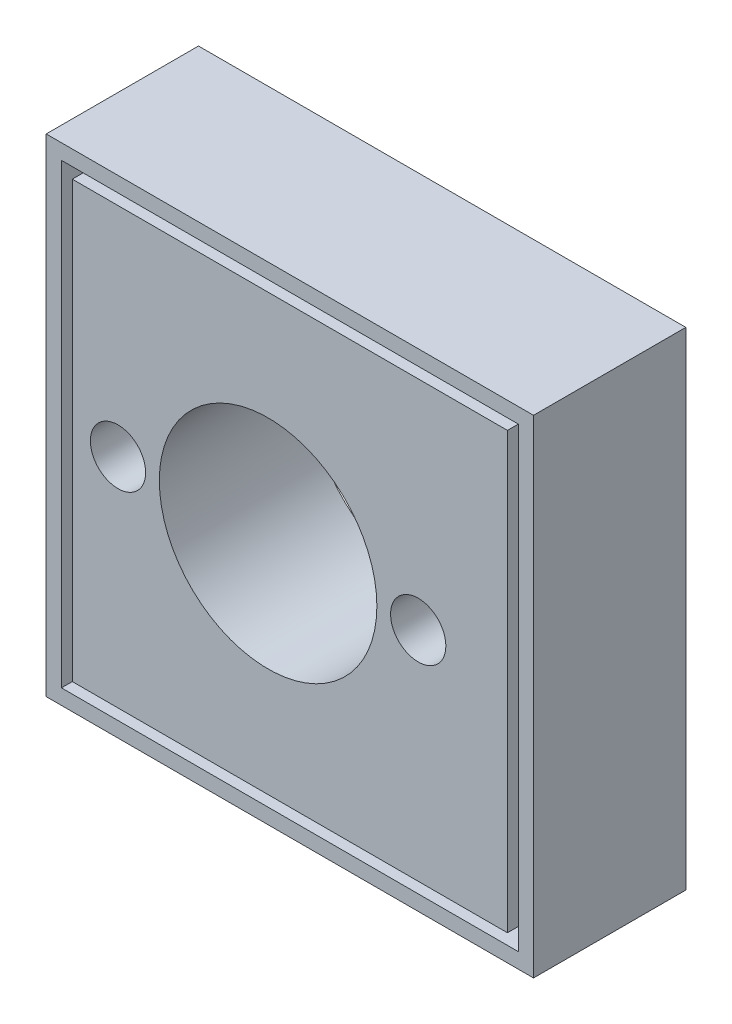
ISO-10303-21;
HEADER;
FILE_DESCRIPTION(('STEP AP214'),'2;1');
FILE_NAME('part.step','',(''),(''),'','','');
FILE_SCHEMA(('AUTOMOTIVE_DESIGN { 1 0 10303 214 1 1 1 1 }'));
ENDSEC;
DATA;
#1=APPLICATION_CONTEXT('core data for automotive mechanical design processes');
#2=APPLICATION_PROTOCOL_DEFINITION('international standard','automotive_design',2000,#1);
#3=PRODUCT_CONTEXT('',#1,'mechanical');
#4=PRODUCT('Part','Part','',(#3));
#5=PRODUCT_RELATED_PRODUCT_CATEGORY('part','',(#4));
#6=PRODUCT_DEFINITION_FORMATION('','',#4);
#7=PRODUCT_DEFINITION_CONTEXT('part definition',#1,'design');
#8=PRODUCT_DEFINITION('design','',#6,#7);
#9=PRODUCT_DEFINITION_SHAPE('','',#8);
#10=(LENGTH_UNIT() NAMED_UNIT(*) SI_UNIT(.MILLI.,.METRE.));
#11=(NAMED_UNIT(*) PLANE_ANGLE_UNIT() SI_UNIT($,.RADIAN.));
#12=(NAMED_UNIT(*) SI_UNIT($,.STERADIAN.) SOLID_ANGLE_UNIT());
#13=UNCERTAINTY_MEASURE_WITH_UNIT(LENGTH_MEASURE(1.E-05),#10,'distance_accuracy_value','');
#14=(GEOMETRIC_REPRESENTATION_CONTEXT(3) GLOBAL_UNCERTAINTY_ASSIGNED_CONTEXT((#13)) GLOBAL_UNIT_ASSIGNED_CONTEXT((#10,
#11,#12)) REPRESENTATION_CONTEXT('',''));
#15=CARTESIAN_POINT('',(0.,0.,0.));
#16=DIRECTION('',(0.,0.,1.));
#17=DIRECTION('',(1.,0.,0.));
#18=AXIS2_PLACEMENT_3D('',#15,#16,#17);
#19=CARTESIAN_POINT('',(0.,0.,15.));
#20=DIRECTION('',(0.,0.,-1.));
#21=DIRECTION('',(-1.,0.,0.));
#22=AXIS2_PLACEMENT_3D('',#19,#20,#21);
#23=PLANE('',#22);
#24=DIRECTION('',(1.,0.,0.));
#25=VECTOR('',#24,1.);
#26=CARTESIAN_POINT('',(0.,-52.5,15.));
#27=LINE('',#26,#25);
#28=CARTESIAN_POINT('',(-52.5,-52.5,15.));
#29=VERTEX_POINT('',#28);
#30=CARTESIAN_POINT('',(52.5,-52.5,15.));
#31=VERTEX_POINT('',#30);
#32=EDGE_CURVE('E81',#29,#31,#27,.T.);
#33=ORIENTED_EDGE('',*,*,#32,.T.);
#34=DIRECTION('',(0.,1.,0.));
#35=VECTOR('',#34,1.);
#36=CARTESIAN_POINT('',(52.5,0.,15.));
#37=LINE('',#36,#35);
#38=CARTESIAN_POINT('',(52.5,52.5,15.));
#39=VERTEX_POINT('',#38);
#40=EDGE_CURVE('E159',#31,#39,#37,.T.);
#41=ORIENTED_EDGE('',*,*,#40,.T.);
#42=DIRECTION('',(1.,0.,0.));
#43=VECTOR('',#42,1.);
#44=CARTESIAN_POINT('',(0.,52.5,15.));
#45=LINE('',#44,#43);
#46=CARTESIAN_POINT('',(-52.5,52.5,15.));
#47=VERTEX_POINT('',#46);
#48=EDGE_CURVE('E175',#47,#39,#45,.T.);
#49=ORIENTED_EDGE('',*,*,#48,.F.);
#50=DIRECTION('',(0.,1.,0.));
#51=VECTOR('',#50,1.);
#52=CARTESIAN_POINT('',(-52.5,0.,15.));
#53=LINE('',#52,#51);
#54=EDGE_CURVE('E86',#29,#47,#53,.T.);
#55=ORIENTED_EDGE('',*,*,#54,.F.);
#56=EDGE_LOOP('',(#33,#41,#49,#55));
#57=FACE_BOUND('',#56,.T.);
#58=DIRECTION('',(1.,0.,0.));
#59=VECTOR('',#58,1.);
#60=CARTESIAN_POINT('',(0.,50.,15.));
#61=LINE('',#60,#59);
#62=CARTESIAN_POINT('',(-50.,50.,15.));
#63=VERTEX_POINT('',#62);
#64=CARTESIAN_POINT('',(50.,50.,15.));
#65=VERTEX_POINT('',#64);
#66=EDGE_CURVE('E261',#63,#65,#61,.T.);
#67=ORIENTED_EDGE('',*,*,#66,.T.);
#68=DIRECTION('',(0.,-1.,0.));
#69=VECTOR('',#68,1.);
#70=CARTESIAN_POINT('',(50.,0.,15.));
#71=LINE('',#70,#69);
#72=CARTESIAN_POINT('',(50.,-50.,15.));
#73=VERTEX_POINT('',#72);
#74=EDGE_CURVE('E257',#65,#73,#71,.T.);
#75=ORIENTED_EDGE('',*,*,#74,.T.);
#76=DIRECTION('',(1.,0.,0.));
#77=VECTOR('',#76,1.);
#78=CARTESIAN_POINT('',(0.,-50.,15.));
#79=LINE('',#78,#77);
#80=CARTESIAN_POINT('',(-50.,-50.,15.));
#81=VERTEX_POINT('',#80);
#82=EDGE_CURVE('E226',#81,#73,#79,.T.);
#83=ORIENTED_EDGE('',*,*,#82,.F.);
#84=DIRECTION('',(0.,-1.,0.));
#85=VECTOR('',#84,1.);
#86=CARTESIAN_POINT('',(-50.,0.,15.));
#87=LINE('',#86,#85);
#88=EDGE_CURVE('E265',#63,#81,#87,.T.);
#89=ORIENTED_EDGE('',*,*,#88,.F.);
#90=EDGE_LOOP('',(#67,#75,#83,#89));
#91=FACE_BOUND('',#90,.T.);
#92=ADVANCED_FACE('F65',(#57,#91),#23,.F.);
#93=CARTESIAN_POINT('',(0.,0.,0.));
#94=DIRECTION('',(0.,0.,-1.));
#95=DIRECTION('',(-1.,0.,0.));
#96=AXIS2_PLACEMENT_3D('',#93,#94,#95);
#97=PLANE('',#96);
#98=DIRECTION('',(0.,1.,0.));
#99=VECTOR('',#98,1.);
#100=CARTESIAN_POINT('',(56.,-56.,0.));
#101=LINE('',#100,#99);
#102=CARTESIAN_POINT('',(56.,-56.,0.));
#103=VERTEX_POINT('',#102);
#104=CARTESIAN_POINT('',(56.,56.,0.));
#105=VERTEX_POINT('',#104);
#106=EDGE_CURVE('E288',#103,#105,#101,.T.);
#107=ORIENTED_EDGE('',*,*,#106,.F.);
#108=DIRECTION('',(1.,0.,0.));
#109=VECTOR('',#108,1.);
#110=CARTESIAN_POINT('',(-56.,-56.,0.));
#111=LINE('',#110,#109);
#112=CARTESIAN_POINT('',(-56.,-56.,0.));
#113=VERTEX_POINT('',#112);
#114=EDGE_CURVE('E298',#113,#103,#111,.T.);
#115=ORIENTED_EDGE('',*,*,#114,.F.);
#116=DIRECTION('',(0.,-1.,0.));
#117=VECTOR('',#116,1.);
#118=CARTESIAN_POINT('',(-56.,-56.,0.));
#119=LINE('',#118,#117);
#120=CARTESIAN_POINT('',(-56.,56.,0.));
#121=VERTEX_POINT('',#120);
#122=EDGE_CURVE('E295',#121,#113,#119,.T.);
#123=ORIENTED_EDGE('',*,*,#122,.F.);
#124=DIRECTION('',(-1.,0.,0.));
#125=VECTOR('',#124,1.);
#126=CARTESIAN_POINT('',(-56.,56.,0.));
#127=LINE('',#126,#125);
#128=EDGE_CURVE('E292',#105,#121,#127,.T.);
#129=ORIENTED_EDGE('',*,*,#128,.F.);
#130=EDGE_LOOP('',(#107,#115,#123,#129));
#131=FACE_BOUND('',#130,.T.);
#132=CARTESIAN_POINT('',(-5.,0.,0.));
#133=DIRECTION('',(0.,0.,1.));
#134=DIRECTION('',(1.,0.,0.));
#135=AXIS2_PLACEMENT_3D('',#132,#133,#134);
#136=CIRCLE('',#135,25.);
#137=CARTESIAN_POINT('',(20.,0.,0.));
#138=VERTEX_POINT('',#137);
#139=EDGE_CURVE('E284',#138,#138,#136,.T.);
#140=ORIENTED_EDGE('',*,*,#139,.T.);
#141=EDGE_LOOP('',(#140));
#142=FACE_BOUND('',#141,.T.);
#143=ADVANCED_FACE('F319',(#131,#142),#97,.T.);
#144=CARTESIAN_POINT('',(56.,-56.,15.));
#145=DIRECTION('',(-1.,0.,0.));
#146=DIRECTION('',(0.,0.,1.));
#147=AXIS2_PLACEMENT_3D('',#144,#145,#146);
#148=PLANE('',#147);
#149=ORIENTED_EDGE('',*,*,#106,.T.);
#150=DIRECTION('',(0.,0.,-1.));
#151=VECTOR('',#150,1.);
#152=CARTESIAN_POINT('',(56.,56.,15.));
#153=LINE('',#152,#151);
#154=CARTESIAN_POINT('',(56.,56.,35.));
#155=VERTEX_POINT('',#154);
#156=EDGE_CURVE('E12',#155,#105,#153,.T.);
#157=ORIENTED_EDGE('',*,*,#156,.F.);
#158=DIRECTION('',(0.,1.,0.));
#159=VECTOR('',#158,1.);
#160=CARTESIAN_POINT('',(56.,0.,35.));
#161=LINE('',#160,#159);
#162=CARTESIAN_POINT('',(56.,-56.,35.));
#163=VERTEX_POINT('',#162);
#164=EDGE_CURVE('E191',#163,#155,#161,.T.);
#165=ORIENTED_EDGE('',*,*,#164,.F.);
#166=DIRECTION('',(0.,0.,-1.));
#167=VECTOR('',#166,1.);
#168=CARTESIAN_POINT('',(56.,-56.,15.));
#169=LINE('',#168,#167);
#170=EDGE_CURVE('E301',#163,#103,#169,.T.);
#171=ORIENTED_EDGE('',*,*,#170,.T.);
#172=EDGE_LOOP('',(#149,#157,#165,#171));
#173=FACE_BOUND('',#172,.T.);
#174=ADVANCED_FACE('F67',(#173),#148,.F.);
#175=CARTESIAN_POINT('',(-56.,56.,15.));
#176=DIRECTION('',(0.,-1.,0.));
#177=DIRECTION('',(0.,0.,-1.));
#178=AXIS2_PLACEMENT_3D('',#175,#176,#177);
#179=PLANE('',#178);
#180=ORIENTED_EDGE('',*,*,#128,.T.);
#181=DIRECTION('',(0.,0.,-1.));
#182=VECTOR('',#181,1.);
#183=CARTESIAN_POINT('',(-56.,56.,15.));
#184=LINE('',#183,#182);
#185=CARTESIAN_POINT('',(-56.,56.,35.));
#186=VERTEX_POINT('',#185);
#187=EDGE_CURVE('E74',#186,#121,#184,.T.);
#188=ORIENTED_EDGE('',*,*,#187,.F.);
#189=DIRECTION('',(-1.,0.,0.));
#190=VECTOR('',#189,1.);
#191=CARTESIAN_POINT('',(0.,56.,35.));
#192=LINE('',#191,#190);
#193=EDGE_CURVE('E195',#155,#186,#192,.T.);
#194=ORIENTED_EDGE('',*,*,#193,.F.);
#195=ORIENTED_EDGE('',*,*,#156,.T.);
#196=EDGE_LOOP('',(#180,#188,#194,#195));
#197=FACE_BOUND('',#196,.T.);
#198=ADVANCED_FACE('F326',(#197),#179,.F.);
#199=CARTESIAN_POINT('',(-56.,-56.,15.));
#200=DIRECTION('',(1.,0.,0.));
#201=DIRECTION('',(0.,0.,-1.));
#202=AXIS2_PLACEMENT_3D('',#199,#200,#201);
#203=PLANE('',#202);
#204=ORIENTED_EDGE('',*,*,#122,.T.);
#205=DIRECTION('',(0.,0.,-1.));
#206=VECTOR('',#205,1.);
#207=CARTESIAN_POINT('',(-56.,-56.,15.));
#208=LINE('',#207,#206);
#209=CARTESIAN_POINT('',(-56.,-56.,35.));
#210=VERTEX_POINT('',#209);
#211=EDGE_CURVE('E305',#210,#113,#208,.T.);
#212=ORIENTED_EDGE('',*,*,#211,.F.);
#213=DIRECTION('',(0.,-1.,0.));
#214=VECTOR('',#213,1.);
#215=CARTESIAN_POINT('',(-56.,0.,35.));
#216=LINE('',#215,#214);
#217=EDGE_CURVE('E199',#186,#210,#216,.T.);
#218=ORIENTED_EDGE('',*,*,#217,.F.);
#219=ORIENTED_EDGE('',*,*,#187,.T.);
#220=EDGE_LOOP('',(#204,#212,#218,#219));
#221=FACE_BOUND('',#220,.T.);
#222=ADVANCED_FACE('F313',(#221),#203,.F.);
#223=CARTESIAN_POINT('',(-56.,-56.,15.));
#224=DIRECTION('',(0.,1.,0.));
#225=DIRECTION('',(0.,0.,1.));
#226=AXIS2_PLACEMENT_3D('',#223,#224,#225);
#227=PLANE('',#226);
#228=ORIENTED_EDGE('',*,*,#114,.T.);
#229=ORIENTED_EDGE('',*,*,#170,.F.);
#230=DIRECTION('',(1.,0.,0.));
#231=VECTOR('',#230,1.);
#232=CARTESIAN_POINT('',(0.,-56.,35.));
#233=LINE('',#232,#231);
#234=EDGE_CURVE('E187',#210,#163,#233,.T.);
#235=ORIENTED_EDGE('',*,*,#234,.F.);
#236=ORIENTED_EDGE('',*,*,#211,.T.);
#237=EDGE_LOOP('',(#228,#229,#235,#236));
#238=FACE_BOUND('',#237,.T.);
#239=ADVANCED_FACE('F322',(#238),#227,.F.);
#240=CARTESIAN_POINT('',(-5.,0.,15.));
#241=DIRECTION('',(0.,0.,-1.));
#242=DIRECTION('',(-1.,0.,0.));
#243=AXIS2_PLACEMENT_3D('',#240,#241,#242);
#244=CYLINDRICAL_SURFACE('',#243,25.);
#245=ORIENTED_EDGE('',*,*,#139,.F.);
#246=EDGE_LOOP('',(#245));
#247=FACE_BOUND('',#246,.T.);
#248=CARTESIAN_POINT('',(-5.,0.,35.));
#249=DIRECTION('',(0.,0.,1.));
#250=DIRECTION('',(1.,0.,0.));
#251=AXIS2_PLACEMENT_3D('',#248,#249,#250);
#252=CIRCLE('',#251,25.);
#253=CARTESIAN_POINT('',(20.,0.,35.));
#254=VERTEX_POINT('',#253);
#255=EDGE_CURVE('E245',#254,#254,#252,.F.);
#256=ORIENTED_EDGE('',*,*,#255,.F.);
#257=EDGE_LOOP('',(#256));
#258=FACE_BOUND('',#257,.T.);
#259=ADVANCED_FACE('F373',(#247,#258),#244,.F.);
#260=CARTESIAN_POINT('',(50.,0.,35.));
#261=DIRECTION('',(1.,0.,0.));
#262=DIRECTION('',(0.,1.,0.));
#263=AXIS2_PLACEMENT_3D('',#260,#261,#262);
#264=PLANE('',#263);
#265=ORIENTED_EDGE('',*,*,#74,.F.);
#266=DIRECTION('',(0.,0.,-1.));
#267=VECTOR('',#266,1.);
#268=CARTESIAN_POINT('',(50.,50.,35.));
#269=LINE('',#268,#267);
#270=CARTESIAN_POINT('',(50.,50.,35.));
#271=VERTEX_POINT('',#270);
#272=EDGE_CURVE('E280',#271,#65,#269,.T.);
#273=ORIENTED_EDGE('',*,*,#272,.F.);
#274=DIRECTION('',(0.,-1.,0.));
#275=VECTOR('',#274,1.);
#276=CARTESIAN_POINT('',(50.,0.,35.));
#277=LINE('',#276,#275);
#278=CARTESIAN_POINT('',(50.,-50.,35.));
#279=VERTEX_POINT('',#278);
#280=EDGE_CURVE('E230',#271,#279,#277,.T.);
#281=ORIENTED_EDGE('',*,*,#280,.T.);
#282=DIRECTION('',(0.,0.,-1.));
#283=VECTOR('',#282,1.);
#284=CARTESIAN_POINT('',(50.,-50.,35.));
#285=LINE('',#284,#283);
#286=EDGE_CURVE('E249',#279,#73,#285,.T.);
#287=ORIENTED_EDGE('',*,*,#286,.T.);
#288=EDGE_LOOP('',(#265,#273,#281,#287));
#289=FACE_BOUND('',#288,.T.);
#290=ADVANCED_FACE('F371',(#289),#264,.T.);
#291=CARTESIAN_POINT('',(0.,50.,35.));
#292=DIRECTION('',(0.,1.,0.));
#293=DIRECTION('',(0.,0.,1.));
#294=AXIS2_PLACEMENT_3D('',#291,#292,#293);
#295=PLANE('',#294);
#296=ORIENTED_EDGE('',*,*,#66,.F.);
#297=DIRECTION('',(0.,0.,-1.));
#298=VECTOR('',#297,1.);
#299=CARTESIAN_POINT('',(-50.,50.,35.));
#300=LINE('',#299,#298);
#301=CARTESIAN_POINT('',(-50.,50.,35.));
#302=VERTEX_POINT('',#301);
#303=EDGE_CURVE('E277',#302,#63,#300,.T.);
#304=ORIENTED_EDGE('',*,*,#303,.F.);
#305=DIRECTION('',(1.,0.,0.));
#306=VECTOR('',#305,1.);
#307=CARTESIAN_POINT('',(0.,50.,35.));
#308=LINE('',#307,#306);
#309=EDGE_CURVE('E234',#302,#271,#308,.T.);
#310=ORIENTED_EDGE('',*,*,#309,.T.);
#311=ORIENTED_EDGE('',*,*,#272,.T.);
#312=EDGE_LOOP('',(#296,#304,#310,#311));
#313=FACE_BOUND('',#312,.T.);
#314=ADVANCED_FACE('F380',(#313),#295,.T.);
#315=CARTESIAN_POINT('',(-50.,0.,35.));
#316=DIRECTION('',(1.,0.,0.));
#317=DIRECTION('',(0.,1.,0.));
#318=AXIS2_PLACEMENT_3D('',#315,#316,#317);
#319=PLANE('',#318);
#320=ORIENTED_EDGE('',*,*,#88,.T.);
#321=DIRECTION('',(0.,0.,-1.));
#322=VECTOR('',#321,1.);
#323=CARTESIAN_POINT('',(-50.,-50.,35.));
#324=LINE('',#323,#322);
#325=CARTESIAN_POINT('',(-50.,-50.,35.));
#326=VERTEX_POINT('',#325);
#327=EDGE_CURVE('E274',#326,#81,#324,.T.);
#328=ORIENTED_EDGE('',*,*,#327,.F.);
#329=DIRECTION('',(0.,-1.,0.));
#330=VECTOR('',#329,1.);
#331=CARTESIAN_POINT('',(-50.,0.,35.));
#332=LINE('',#331,#330);
#333=EDGE_CURVE('E238',#302,#326,#332,.T.);
#334=ORIENTED_EDGE('',*,*,#333,.F.);
#335=ORIENTED_EDGE('',*,*,#303,.T.);
#336=EDGE_LOOP('',(#320,#328,#334,#335));
#337=FACE_BOUND('',#336,.T.);
#338=ADVANCED_FACE('F367',(#337),#319,.F.);
#339=CARTESIAN_POINT('',(0.,-50.,35.));
#340=DIRECTION('',(0.,1.,0.));
#341=DIRECTION('',(0.,0.,1.));
#342=AXIS2_PLACEMENT_3D('',#339,#340,#341);
#343=PLANE('',#342);
#344=ORIENTED_EDGE('',*,*,#82,.T.);
#345=ORIENTED_EDGE('',*,*,#286,.F.);
#346=DIRECTION('',(1.,0.,0.));
#347=VECTOR('',#346,1.);
#348=CARTESIAN_POINT('',(0.,-50.,35.));
#349=LINE('',#348,#347);
#350=EDGE_CURVE('E242',#326,#279,#349,.T.);
#351=ORIENTED_EDGE('',*,*,#350,.F.);
#352=ORIENTED_EDGE('',*,*,#327,.T.);
#353=EDGE_LOOP('',(#344,#345,#351,#352));
#354=FACE_BOUND('',#353,.T.);
#355=ADVANCED_FACE('F358',(#354),#343,.F.);
#356=CARTESIAN_POINT('',(-39.5,0.,35.));
#357=DIRECTION('',(0.,0.,-1.));
#358=DIRECTION('',(-1.,0.,0.));
#359=AXIS2_PLACEMENT_3D('',#356,#357,#358);
#360=CYLINDRICAL_SURFACE('',#359,6.35);
#361=CARTESIAN_POINT('',(-39.5,0.,35.));
#362=DIRECTION('',(0.,0.,1.));
#363=DIRECTION('',(1.,0.,0.));
#364=AXIS2_PLACEMENT_3D('',#361,#362,#363);
#365=CIRCLE('',#364,6.35);
#366=CARTESIAN_POINT('',(-33.15,0.,35.));
#367=VERTEX_POINT('',#366);
#368=EDGE_CURVE('E225',#367,#367,#365,.T.);
#369=ORIENTED_EDGE('',*,*,#368,.T.);
#370=EDGE_LOOP('',(#369));
#371=FACE_BOUND('',#370,.T.);
#372=CARTESIAN_POINT('',(-39.5,0.,15.));
#373=DIRECTION('',(0.,0.,1.));
#374=DIRECTION('',(1.,0.,0.));
#375=AXIS2_PLACEMENT_3D('',#372,#373,#374);
#376=CIRCLE('',#375,6.35);
#377=CARTESIAN_POINT('',(-33.15,0.,15.));
#378=VERTEX_POINT('',#377);
#379=EDGE_CURVE('E253',#378,#378,#376,.T.);
#380=ORIENTED_EDGE('',*,*,#379,.F.);
#381=EDGE_LOOP('',(#380));
#382=FACE_BOUND('',#381,.T.);
#383=ADVANCED_FACE('F356',(#371,#382),#360,.F.);
#384=CARTESIAN_POINT('',(29.5,0.,35.));
#385=DIRECTION('',(0.,0.,-1.));
#386=DIRECTION('',(-1.,0.,0.));
#387=AXIS2_PLACEMENT_3D('',#384,#385,#386);
#388=CYLINDRICAL_SURFACE('',#387,6.35);
#389=CARTESIAN_POINT('',(29.5,0.,35.));
#390=DIRECTION('',(0.,0.,1.));
#391=DIRECTION('',(1.,0.,0.));
#392=AXIS2_PLACEMENT_3D('',#389,#390,#391);
#393=CIRCLE('',#392,6.35);
#394=CARTESIAN_POINT('',(35.85,0.,35.));
#395=VERTEX_POINT('',#394);
#396=EDGE_CURVE('E221',#395,#395,#393,.T.);
#397=ORIENTED_EDGE('',*,*,#396,.T.);
#398=EDGE_LOOP('',(#397));
#399=FACE_BOUND('',#398,.T.);
#400=CARTESIAN_POINT('',(29.5,0.,15.));
#401=DIRECTION('',(0.,0.,1.));
#402=DIRECTION('',(1.,0.,0.));
#403=AXIS2_PLACEMENT_3D('',#400,#401,#402);
#404=CIRCLE('',#403,6.35);
#405=CARTESIAN_POINT('',(35.85,0.,15.));
#406=VERTEX_POINT('',#405);
#407=EDGE_CURVE('E163',#406,#406,#404,.T.);
#408=ORIENTED_EDGE('',*,*,#407,.F.);
#409=EDGE_LOOP('',(#408));
#410=FACE_BOUND('',#409,.T.);
#411=ADVANCED_FACE('F351',(#399,#410),#388,.F.);
#412=CARTESIAN_POINT('',(0.,0.,35.));
#413=DIRECTION('',(0.,0.,1.));
#414=DIRECTION('',(1.,0.,0.));
#415=AXIS2_PLACEMENT_3D('',#412,#413,#414);
#416=PLANE('',#415);
#417=ORIENTED_EDGE('',*,*,#396,.F.);
#418=EDGE_LOOP('',(#417));
#419=FACE_BOUND('',#418,.T.);
#420=ORIENTED_EDGE('',*,*,#368,.F.);
#421=EDGE_LOOP('',(#420));
#422=FACE_BOUND('',#421,.T.);
#423=ORIENTED_EDGE('',*,*,#280,.F.);
#424=ORIENTED_EDGE('',*,*,#309,.F.);
#425=ORIENTED_EDGE('',*,*,#333,.T.);
#426=ORIENTED_EDGE('',*,*,#350,.T.);
#427=EDGE_LOOP('',(#423,#424,#425,#426));
#428=FACE_BOUND('',#427,.T.);
#429=ORIENTED_EDGE('',*,*,#255,.T.);
#430=EDGE_LOOP('',(#429));
#431=FACE_BOUND('',#430,.T.);
#432=ADVANCED_FACE('F346',(#419,#422,#428,#431),#416,.T.);
#433=ORIENTED_EDGE('',*,*,#379,.T.);
#434=EDGE_LOOP('',(#433));
#435=FACE_BOUND('',#434,.T.);
#436=ADVANCED_FACE('F336',(#435),#23,.F.);
#437=ORIENTED_EDGE('',*,*,#407,.T.);
#438=EDGE_LOOP('',(#437));
#439=FACE_BOUND('',#438,.T.);
#440=ADVANCED_FACE('F335',(#439),#23,.F.);
#441=CARTESIAN_POINT('',(52.5,0.,35.));
#442=DIRECTION('',(-1.,0.,0.));
#443=DIRECTION('',(0.,0.,1.));
#444=AXIS2_PLACEMENT_3D('',#441,#442,#443);
#445=PLANE('',#444);
#446=ORIENTED_EDGE('',*,*,#40,.F.);
#447=DIRECTION('',(0.,0.,-1.));
#448=VECTOR('',#447,1.);
#449=CARTESIAN_POINT('',(52.5,-52.5,35.));
#450=LINE('',#449,#448);
#451=CARTESIAN_POINT('',(52.5,-52.5,35.));
#452=VERTEX_POINT('',#451);
#453=EDGE_CURVE('E154',#452,#31,#450,.T.);
#454=ORIENTED_EDGE('',*,*,#453,.F.);
#455=DIRECTION('',(0.,1.,0.));
#456=VECTOR('',#455,1.);
#457=CARTESIAN_POINT('',(52.5,0.,35.));
#458=LINE('',#457,#456);
#459=CARTESIAN_POINT('',(52.5,52.5,35.));
#460=VERTEX_POINT('',#459);
#461=EDGE_CURVE('E158',#452,#460,#458,.T.);
#462=ORIENTED_EDGE('',*,*,#461,.T.);
#463=DIRECTION('',(0.,0.,-1.));
#464=VECTOR('',#463,1.);
#465=CARTESIAN_POINT('',(52.5,52.5,35.));
#466=LINE('',#465,#464);
#467=EDGE_CURVE('E203',#460,#39,#466,.T.);
#468=ORIENTED_EDGE('',*,*,#467,.T.);
#469=EDGE_LOOP('',(#446,#454,#462,#468));
#470=FACE_BOUND('',#469,.T.);
#471=ADVANCED_FACE('F156',(#470),#445,.T.);
#472=CARTESIAN_POINT('',(0.,-52.5,35.));
#473=DIRECTION('',(0.,1.,0.));
#474=DIRECTION('',(0.,0.,1.));
#475=AXIS2_PLACEMENT_3D('',#472,#473,#474);
#476=PLANE('',#475);
#477=ORIENTED_EDGE('',*,*,#32,.F.);
#478=DIRECTION('',(0.,0.,-1.));
#479=VECTOR('',#478,1.);
#480=CARTESIAN_POINT('',(-52.5,-52.5,35.));
#481=LINE('',#480,#479);
#482=CARTESIAN_POINT('',(-52.5,-52.5,35.));
#483=VERTEX_POINT('',#482);
#484=EDGE_CURVE('E164',#483,#29,#481,.T.);
#485=ORIENTED_EDGE('',*,*,#484,.F.);
#486=DIRECTION('',(1.,0.,0.));
#487=VECTOR('',#486,1.);
#488=CARTESIAN_POINT('',(0.,-52.5,35.));
#489=LINE('',#488,#487);
#490=EDGE_CURVE('E170',#483,#452,#489,.T.);
#491=ORIENTED_EDGE('',*,*,#490,.T.);
#492=ORIENTED_EDGE('',*,*,#453,.T.);
#493=EDGE_LOOP('',(#477,#485,#491,#492));
#494=FACE_BOUND('',#493,.T.);
#495=ADVANCED_FACE('F177',(#494),#476,.T.);
#496=CARTESIAN_POINT('',(-52.5,0.,35.));
#497=DIRECTION('',(-1.,0.,0.));
#498=DIRECTION('',(0.,0.,1.));
#499=AXIS2_PLACEMENT_3D('',#496,#497,#498);
#500=PLANE('',#499);
#501=ORIENTED_EDGE('',*,*,#54,.T.);
#502=DIRECTION('',(0.,0.,-1.));
#503=VECTOR('',#502,1.);
#504=CARTESIAN_POINT('',(-52.5,52.5,35.));
#505=LINE('',#504,#503);
#506=CARTESIAN_POINT('',(-52.5,52.5,35.));
#507=VERTEX_POINT('',#506);
#508=EDGE_CURVE('E215',#507,#47,#505,.T.);
#509=ORIENTED_EDGE('',*,*,#508,.F.);
#510=DIRECTION('',(0.,1.,0.));
#511=VECTOR('',#510,1.);
#512=CARTESIAN_POINT('',(-52.5,0.,35.));
#513=LINE('',#512,#511);
#514=EDGE_CURVE('E180',#483,#507,#513,.T.);
#515=ORIENTED_EDGE('',*,*,#514,.F.);
#516=ORIENTED_EDGE('',*,*,#484,.T.);
#517=EDGE_LOOP('',(#501,#509,#515,#516));
#518=FACE_BOUND('',#517,.T.);
#519=ADVANCED_FACE('F463',(#518),#500,.F.);
#520=CARTESIAN_POINT('',(0.,52.5,35.));
#521=DIRECTION('',(0.,1.,0.));
#522=DIRECTION('',(0.,0.,1.));
#523=AXIS2_PLACEMENT_3D('',#520,#521,#522);
#524=PLANE('',#523);
#525=ORIENTED_EDGE('',*,*,#48,.T.);
#526=ORIENTED_EDGE('',*,*,#467,.F.);
#527=DIRECTION('',(1.,0.,0.));
#528=VECTOR('',#527,1.);
#529=CARTESIAN_POINT('',(0.,52.5,35.));
#530=LINE('',#529,#528);
#531=EDGE_CURVE('E172',#507,#460,#530,.T.);
#532=ORIENTED_EDGE('',*,*,#531,.F.);
#533=ORIENTED_EDGE('',*,*,#508,.T.);
#534=EDGE_LOOP('',(#525,#526,#532,#533));
#535=FACE_BOUND('',#534,.T.);
#536=ADVANCED_FACE('F472',(#535),#524,.F.);
#537=CARTESIAN_POINT('',(0.,0.,35.));
#538=DIRECTION('',(0.,0.,1.));
#539=DIRECTION('',(1.,0.,0.));
#540=AXIS2_PLACEMENT_3D('',#537,#538,#539);
#541=PLANE('',#540);
#542=ORIENTED_EDGE('',*,*,#461,.F.);
#543=ORIENTED_EDGE('',*,*,#490,.F.);
#544=ORIENTED_EDGE('',*,*,#514,.T.);
#545=ORIENTED_EDGE('',*,*,#531,.T.);
#546=EDGE_LOOP('',(#542,#543,#544,#545));
#547=FACE_BOUND('',#546,.T.);
#548=ORIENTED_EDGE('',*,*,#234,.T.);
#549=ORIENTED_EDGE('',*,*,#164,.T.);
#550=ORIENTED_EDGE('',*,*,#193,.T.);
#551=ORIENTED_EDGE('',*,*,#217,.T.);
#552=EDGE_LOOP('',(#548,#549,#550,#551));
#553=FACE_BOUND('',#552,.T.);
#554=ADVANCED_FACE('F168',(#547,#553),#541,.T.);
#555=CLOSED_SHELL('',(#92,#143,#174,#198,#222,#239,#259,#290,#314,#338,#355,#383,#411,#432,#436,
#440,#471,#495,#519,#536,#554));
#556=MANIFOLD_SOLID_BREP('B2',#555);
#557=ADVANCED_BREP_SHAPE_REPRESENTATION('',(#18,#556),#14);
#558=SHAPE_DEFINITION_REPRESENTATION(#9,#557);
ENDSEC;
END-ISO-10303-21;
